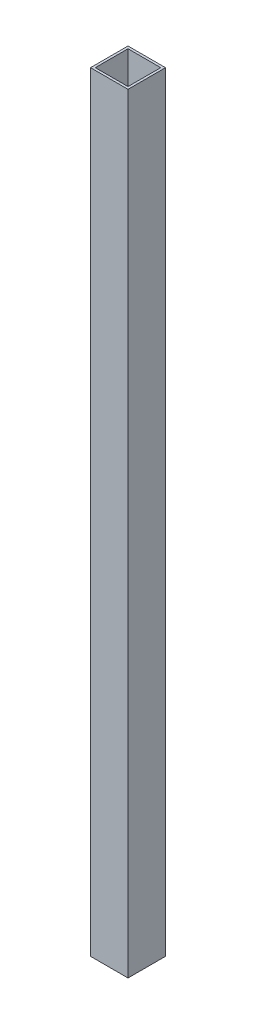
ISO-10303-21;
HEADER;
FILE_DESCRIPTION(('STEP AP214'),'2;1');
FILE_NAME('part.step','',(''),(''),'','','');
FILE_SCHEMA(('AUTOMOTIVE_DESIGN { 1 0 10303 214 1 1 1 1 }'));
ENDSEC;
DATA;
#1=APPLICATION_CONTEXT('core data for automotive mechanical design processes');
#2=APPLICATION_PROTOCOL_DEFINITION('international standard','automotive_design',2000,#1);
#3=PRODUCT_CONTEXT('',#1,'mechanical');
#4=PRODUCT('Part','Part','',(#3));
#5=PRODUCT_RELATED_PRODUCT_CATEGORY('part','',(#4));
#6=PRODUCT_DEFINITION_FORMATION('','',#4);
#7=PRODUCT_DEFINITION_CONTEXT('part definition',#1,'design');
#8=PRODUCT_DEFINITION('design','',#6,#7);
#9=PRODUCT_DEFINITION_SHAPE('','',#8);
#10=(LENGTH_UNIT() NAMED_UNIT(*) SI_UNIT(.MILLI.,.METRE.));
#11=(NAMED_UNIT(*) PLANE_ANGLE_UNIT() SI_UNIT($,.RADIAN.));
#12=(NAMED_UNIT(*) SI_UNIT($,.STERADIAN.) SOLID_ANGLE_UNIT());
#13=UNCERTAINTY_MEASURE_WITH_UNIT(LENGTH_MEASURE(1.E-05),#10,'distance_accuracy_value','');
#14=(GEOMETRIC_REPRESENTATION_CONTEXT(3) GLOBAL_UNCERTAINTY_ASSIGNED_CONTEXT((#13)) GLOBAL_UNIT_ASSIGNED_CONTEXT((#10,
#11,#12)) REPRESENTATION_CONTEXT('',''));
#15=CARTESIAN_POINT('',(0.,0.,0.));
#16=DIRECTION('',(0.,0.,1.));
#17=DIRECTION('',(1.,0.,0.));
#18=AXIS2_PLACEMENT_3D('',#15,#16,#17);
#19=CARTESIAN_POINT('',(0.,195.,0.));
#20=DIRECTION('',(0.,-1.,0.));
#21=DIRECTION('',(0.,0.,-1.));
#22=AXIS2_PLACEMENT_3D('',#19,#20,#21);
#23=PLANE('',#22);
#24=DIRECTION('',(0.,0.,-1.));
#25=VECTOR('',#24,1.);
#26=CARTESIAN_POINT('',(9.5,195.,9.49999999999999));
#27=LINE('',#26,#25);
#28=CARTESIAN_POINT('',(9.5,195.,9.49999999999999));
#29=VERTEX_POINT('',#28);
#30=CARTESIAN_POINT('',(9.5,195.,-9.49999999999999));
#31=VERTEX_POINT('',#30);
#32=EDGE_CURVE('E157',#29,#31,#27,.T.);
#33=ORIENTED_EDGE('',*,*,#32,.T.);
#34=DIRECTION('',(-1.,0.,0.));
#35=VECTOR('',#34,1.);
#36=CARTESIAN_POINT('',(-9.5,195.,-9.49999999999999));
#37=LINE('',#36,#35);
#38=CARTESIAN_POINT('',(-9.5,195.,-9.49999999999999));
#39=VERTEX_POINT('',#38);
#40=EDGE_CURVE('E161',#31,#39,#37,.T.);
#41=ORIENTED_EDGE('',*,*,#40,.T.);
#42=DIRECTION('',(0.,0.,1.));
#43=VECTOR('',#42,1.);
#44=CARTESIAN_POINT('',(-9.5,195.,9.49999999999999));
#45=LINE('',#44,#43);
#46=CARTESIAN_POINT('',(-9.5,195.,9.49999999999999));
#47=VERTEX_POINT('',#46);
#48=EDGE_CURVE('E165',#39,#47,#45,.T.);
#49=ORIENTED_EDGE('',*,*,#48,.T.);
#50=DIRECTION('',(1.,0.,0.));
#51=VECTOR('',#50,1.);
#52=CARTESIAN_POINT('',(-9.5,195.,9.49999999999999));
#53=LINE('',#52,#51);
#54=EDGE_CURVE('E168',#47,#29,#53,.T.);
#55=ORIENTED_EDGE('',*,*,#54,.T.);
#56=EDGE_LOOP('',(#33,#41,#49,#55));
#57=FACE_BOUND('',#56,.T.);
#58=DIRECTION('',(0.,0.,-1.));
#59=VECTOR('',#58,1.);
#60=CARTESIAN_POINT('',(8.3,195.,8.3));
#61=LINE('',#60,#59);
#62=CARTESIAN_POINT('',(8.3,195.,8.3));
#63=VERTEX_POINT('',#62);
#64=CARTESIAN_POINT('',(8.3,195.,-8.3));
#65=VERTEX_POINT('',#64);
#66=EDGE_CURVE('E109',#63,#65,#61,.T.);
#67=ORIENTED_EDGE('',*,*,#66,.F.);
#68=DIRECTION('',(1.,0.,0.));
#69=VECTOR('',#68,1.);
#70=CARTESIAN_POINT('',(-8.3,195.,8.3));
#71=LINE('',#70,#69);
#72=CARTESIAN_POINT('',(-8.3,195.,8.3));
#73=VERTEX_POINT('',#72);
#74=EDGE_CURVE('E135',#73,#63,#71,.T.);
#75=ORIENTED_EDGE('',*,*,#74,.F.);
#76=DIRECTION('',(0.,0.,1.));
#77=VECTOR('',#76,1.);
#78=CARTESIAN_POINT('',(-8.3,195.,8.3));
#79=LINE('',#78,#77);
#80=CARTESIAN_POINT('',(-8.3,195.,-8.3));
#81=VERTEX_POINT('',#80);
#82=EDGE_CURVE('E131',#81,#73,#79,.T.);
#83=ORIENTED_EDGE('',*,*,#82,.F.);
#84=DIRECTION('',(-1.,0.,0.));
#85=VECTOR('',#84,1.);
#86=CARTESIAN_POINT('',(-8.3,195.,-8.3));
#87=LINE('',#86,#85);
#88=EDGE_CURVE('E118',#65,#81,#87,.T.);
#89=ORIENTED_EDGE('',*,*,#88,.F.);
#90=EDGE_LOOP('',(#67,#75,#83,#89));
#91=FACE_BOUND('',#90,.T.);
#92=ADVANCED_FACE('F43',(#57,#91),#23,.F.);
#93=CARTESIAN_POINT('',(0.,-195.,0.));
#94=DIRECTION('',(0.,-1.,0.));
#95=DIRECTION('',(0.,0.,-1.));
#96=AXIS2_PLACEMENT_3D('',#93,#94,#95);
#97=PLANE('',#96);
#98=DIRECTION('',(0.,0.,-1.));
#99=VECTOR('',#98,1.);
#100=CARTESIAN_POINT('',(9.5,-195.,9.49999999999999));
#101=LINE('',#100,#99);
#102=CARTESIAN_POINT('',(9.5,-195.,9.49999999999999));
#103=VERTEX_POINT('',#102);
#104=CARTESIAN_POINT('',(9.5,-195.,-9.49999999999999));
#105=VERTEX_POINT('',#104);
#106=EDGE_CURVE('E127',#103,#105,#101,.T.);
#107=ORIENTED_EDGE('',*,*,#106,.F.);
#108=DIRECTION('',(1.,0.,0.));
#109=VECTOR('',#108,1.);
#110=CARTESIAN_POINT('',(-9.5,-195.,9.49999999999999));
#111=LINE('',#110,#109);
#112=CARTESIAN_POINT('',(-9.5,-195.,9.49999999999999));
#113=VERTEX_POINT('',#112);
#114=EDGE_CURVE('E162',#113,#103,#111,.T.);
#115=ORIENTED_EDGE('',*,*,#114,.F.);
#116=DIRECTION('',(0.,0.,1.));
#117=VECTOR('',#116,1.);
#118=CARTESIAN_POINT('',(-9.5,-195.,9.49999999999999));
#119=LINE('',#118,#117);
#120=CARTESIAN_POINT('',(-9.5,-195.,-9.49999999999999));
#121=VERTEX_POINT('',#120);
#122=EDGE_CURVE('E178',#121,#113,#119,.T.);
#123=ORIENTED_EDGE('',*,*,#122,.F.);
#124=DIRECTION('',(-1.,0.,0.));
#125=VECTOR('',#124,1.);
#126=CARTESIAN_POINT('',(-9.5,-195.,-9.49999999999999));
#127=LINE('',#126,#125);
#128=EDGE_CURVE('E175',#105,#121,#127,.T.);
#129=ORIENTED_EDGE('',*,*,#128,.F.);
#130=EDGE_LOOP('',(#107,#115,#123,#129));
#131=FACE_BOUND('',#130,.T.);
#132=DIRECTION('',(1.,0.,0.));
#133=VECTOR('',#132,1.);
#134=CARTESIAN_POINT('',(-8.3,-195.,8.3));
#135=LINE('',#134,#133);
#136=CARTESIAN_POINT('',(-8.3,-195.,8.3));
#137=VERTEX_POINT('',#136);
#138=CARTESIAN_POINT('',(8.3,-195.,8.3));
#139=VERTEX_POINT('',#138);
#140=EDGE_CURVE('E119',#137,#139,#135,.T.);
#141=ORIENTED_EDGE('',*,*,#140,.T.);
#142=DIRECTION('',(0.,0.,-1.));
#143=VECTOR('',#142,1.);
#144=CARTESIAN_POINT('',(8.3,-195.,8.3));
#145=LINE('',#144,#143);
#146=CARTESIAN_POINT('',(8.3,-195.,-8.3));
#147=VERTEX_POINT('',#146);
#148=EDGE_CURVE('E67',#139,#147,#145,.T.);
#149=ORIENTED_EDGE('',*,*,#148,.T.);
#150=DIRECTION('',(-1.,0.,0.));
#151=VECTOR('',#150,1.);
#152=CARTESIAN_POINT('',(-8.3,-195.,-8.3));
#153=LINE('',#152,#151);
#154=CARTESIAN_POINT('',(-8.3,-195.,-8.3));
#155=VERTEX_POINT('',#154);
#156=EDGE_CURVE('E125',#147,#155,#153,.T.);
#157=ORIENTED_EDGE('',*,*,#156,.T.);
#158=DIRECTION('',(0.,0.,1.));
#159=VECTOR('',#158,1.);
#160=CARTESIAN_POINT('',(-8.3,-195.,8.3));
#161=LINE('',#160,#159);
#162=EDGE_CURVE('E144',#155,#137,#161,.T.);
#163=ORIENTED_EDGE('',*,*,#162,.T.);
#164=EDGE_LOOP('',(#141,#149,#157,#163));
#165=FACE_BOUND('',#164,.T.);
#166=ADVANCED_FACE('F201',(#131,#165),#97,.T.);
#167=CARTESIAN_POINT('',(9.5,195.,9.49999999999999));
#168=DIRECTION('',(-1.,0.,0.));
#169=DIRECTION('',(0.,0.,1.));
#170=AXIS2_PLACEMENT_3D('',#167,#168,#169);
#171=PLANE('',#170);
#172=ORIENTED_EDGE('',*,*,#106,.T.);
#173=DIRECTION('',(0.,-1.,0.));
#174=VECTOR('',#173,1.);
#175=CARTESIAN_POINT('',(9.5,195.,-9.49999999999999));
#176=LINE('',#175,#174);
#177=EDGE_CURVE('E11',#31,#105,#176,.T.);
#178=ORIENTED_EDGE('',*,*,#177,.F.);
#179=ORIENTED_EDGE('',*,*,#32,.F.);
#180=DIRECTION('',(0.,-1.,0.));
#181=VECTOR('',#180,1.);
#182=CARTESIAN_POINT('',(9.5,195.,9.49999999999999));
#183=LINE('',#182,#181);
#184=EDGE_CURVE('E171',#29,#103,#183,.T.);
#185=ORIENTED_EDGE('',*,*,#184,.T.);
#186=EDGE_LOOP('',(#172,#178,#179,#185));
#187=FACE_BOUND('',#186,.T.);
#188=ADVANCED_FACE('F45',(#187),#171,.F.);
#189=CARTESIAN_POINT('',(-9.5,195.,-9.49999999999999));
#190=DIRECTION('',(0.,0.,1.));
#191=DIRECTION('',(1.,0.,0.));
#192=AXIS2_PLACEMENT_3D('',#189,#190,#191);
#193=PLANE('',#192);
#194=ORIENTED_EDGE('',*,*,#128,.T.);
#195=DIRECTION('',(0.,-1.,0.));
#196=VECTOR('',#195,1.);
#197=CARTESIAN_POINT('',(-9.5,195.,-9.49999999999999));
#198=LINE('',#197,#196);
#199=EDGE_CURVE('E52',#39,#121,#198,.T.);
#200=ORIENTED_EDGE('',*,*,#199,.F.);
#201=ORIENTED_EDGE('',*,*,#40,.F.);
#202=ORIENTED_EDGE('',*,*,#177,.T.);
#203=EDGE_LOOP('',(#194,#200,#201,#202));
#204=FACE_BOUND('',#203,.T.);
#205=ADVANCED_FACE('F211',(#204),#193,.F.);
#206=CARTESIAN_POINT('',(-9.5,195.,9.49999999999999));
#207=DIRECTION('',(1.,0.,0.));
#208=DIRECTION('',(0.,0.,-1.));
#209=AXIS2_PLACEMENT_3D('',#206,#207,#208);
#210=PLANE('',#209);
#211=ORIENTED_EDGE('',*,*,#122,.T.);
#212=DIRECTION('',(0.,-1.,0.));
#213=VECTOR('',#212,1.);
#214=CARTESIAN_POINT('',(-9.5,195.,9.49999999999999));
#215=LINE('',#214,#213);
#216=EDGE_CURVE('E186',#47,#113,#215,.T.);
#217=ORIENTED_EDGE('',*,*,#216,.F.);
#218=ORIENTED_EDGE('',*,*,#48,.F.);
#219=ORIENTED_EDGE('',*,*,#199,.T.);
#220=EDGE_LOOP('',(#211,#217,#218,#219));
#221=FACE_BOUND('',#220,.T.);
#222=ADVANCED_FACE('F195',(#221),#210,.F.);
#223=CARTESIAN_POINT('',(-9.5,195.,9.49999999999999));
#224=DIRECTION('',(0.,0.,-1.));
#225=DIRECTION('',(-1.,0.,0.));
#226=AXIS2_PLACEMENT_3D('',#223,#224,#225);
#227=PLANE('',#226);
#228=ORIENTED_EDGE('',*,*,#114,.T.);
#229=ORIENTED_EDGE('',*,*,#184,.F.);
#230=ORIENTED_EDGE('',*,*,#54,.F.);
#231=ORIENTED_EDGE('',*,*,#216,.T.);
#232=EDGE_LOOP('',(#228,#229,#230,#231));
#233=FACE_BOUND('',#232,.T.);
#234=ADVANCED_FACE('F205',(#233),#227,.F.);
#235=CARTESIAN_POINT('',(8.3,195.,8.3));
#236=DIRECTION('',(-1.,0.,0.));
#237=DIRECTION('',(0.,0.,1.));
#238=AXIS2_PLACEMENT_3D('',#235,#236,#237);
#239=PLANE('',#238);
#240=ORIENTED_EDGE('',*,*,#148,.F.);
#241=DIRECTION('',(0.,-1.,0.));
#242=VECTOR('',#241,1.);
#243=CARTESIAN_POINT('',(8.3,195.,8.3));
#244=LINE('',#243,#242);
#245=EDGE_CURVE('E113',#63,#139,#244,.T.);
#246=ORIENTED_EDGE('',*,*,#245,.F.);
#247=ORIENTED_EDGE('',*,*,#66,.T.);
#248=DIRECTION('',(0.,-1.,0.));
#249=VECTOR('',#248,1.);
#250=CARTESIAN_POINT('',(8.3,195.,-8.3));
#251=LINE('',#250,#249);
#252=EDGE_CURVE('E112',#65,#147,#251,.T.);
#253=ORIENTED_EDGE('',*,*,#252,.T.);
#254=EDGE_LOOP('',(#240,#246,#247,#253));
#255=FACE_BOUND('',#254,.T.);
#256=ADVANCED_FACE('F111',(#255),#239,.T.);
#257=CARTESIAN_POINT('',(-8.3,195.,-8.3));
#258=DIRECTION('',(0.,0.,1.));
#259=DIRECTION('',(1.,0.,0.));
#260=AXIS2_PLACEMENT_3D('',#257,#258,#259);
#261=PLANE('',#260);
#262=ORIENTED_EDGE('',*,*,#156,.F.);
#263=ORIENTED_EDGE('',*,*,#252,.F.);
#264=ORIENTED_EDGE('',*,*,#88,.T.);
#265=DIRECTION('',(0.,-1.,0.));
#266=VECTOR('',#265,1.);
#267=CARTESIAN_POINT('',(-8.3,195.,-8.3));
#268=LINE('',#267,#266);
#269=EDGE_CURVE('E128',#81,#155,#268,.T.);
#270=ORIENTED_EDGE('',*,*,#269,.T.);
#271=EDGE_LOOP('',(#262,#263,#264,#270));
#272=FACE_BOUND('',#271,.T.);
#273=ADVANCED_FACE('F122',(#272),#261,.T.);
#274=CARTESIAN_POINT('',(-8.3,195.,8.3));
#275=DIRECTION('',(1.,0.,0.));
#276=DIRECTION('',(0.,0.,-1.));
#277=AXIS2_PLACEMENT_3D('',#274,#275,#276);
#278=PLANE('',#277);
#279=ORIENTED_EDGE('',*,*,#162,.F.);
#280=ORIENTED_EDGE('',*,*,#269,.F.);
#281=ORIENTED_EDGE('',*,*,#82,.T.);
#282=DIRECTION('',(0.,-1.,0.));
#283=VECTOR('',#282,1.);
#284=CARTESIAN_POINT('',(-8.3,195.,8.3));
#285=LINE('',#284,#283);
#286=EDGE_CURVE('E59',#73,#137,#285,.T.);
#287=ORIENTED_EDGE('',*,*,#286,.T.);
#288=EDGE_LOOP('',(#279,#280,#281,#287));
#289=FACE_BOUND('',#288,.T.);
#290=ADVANCED_FACE('F234',(#289),#278,.T.);
#291=CARTESIAN_POINT('',(-8.3,195.,8.3));
#292=DIRECTION('',(0.,0.,-1.));
#293=DIRECTION('',(-1.,0.,0.));
#294=AXIS2_PLACEMENT_3D('',#291,#292,#293);
#295=PLANE('',#294);
#296=ORIENTED_EDGE('',*,*,#140,.F.);
#297=ORIENTED_EDGE('',*,*,#286,.F.);
#298=ORIENTED_EDGE('',*,*,#74,.T.);
#299=ORIENTED_EDGE('',*,*,#245,.T.);
#300=EDGE_LOOP('',(#296,#297,#298,#299));
#301=FACE_BOUND('',#300,.T.);
#302=ADVANCED_FACE('F238',(#301),#295,.T.);
#303=CLOSED_SHELL('',(#92,#166,#188,#205,#222,#234,#256,#273,#290,#302));
#304=MANIFOLD_SOLID_BREP('B2',#303);
#305=ADVANCED_BREP_SHAPE_REPRESENTATION('',(#18,#304),#14);
#306=SHAPE_DEFINITION_REPRESENTATION(#9,#305);
ENDSEC;
END-ISO-10303-21;
